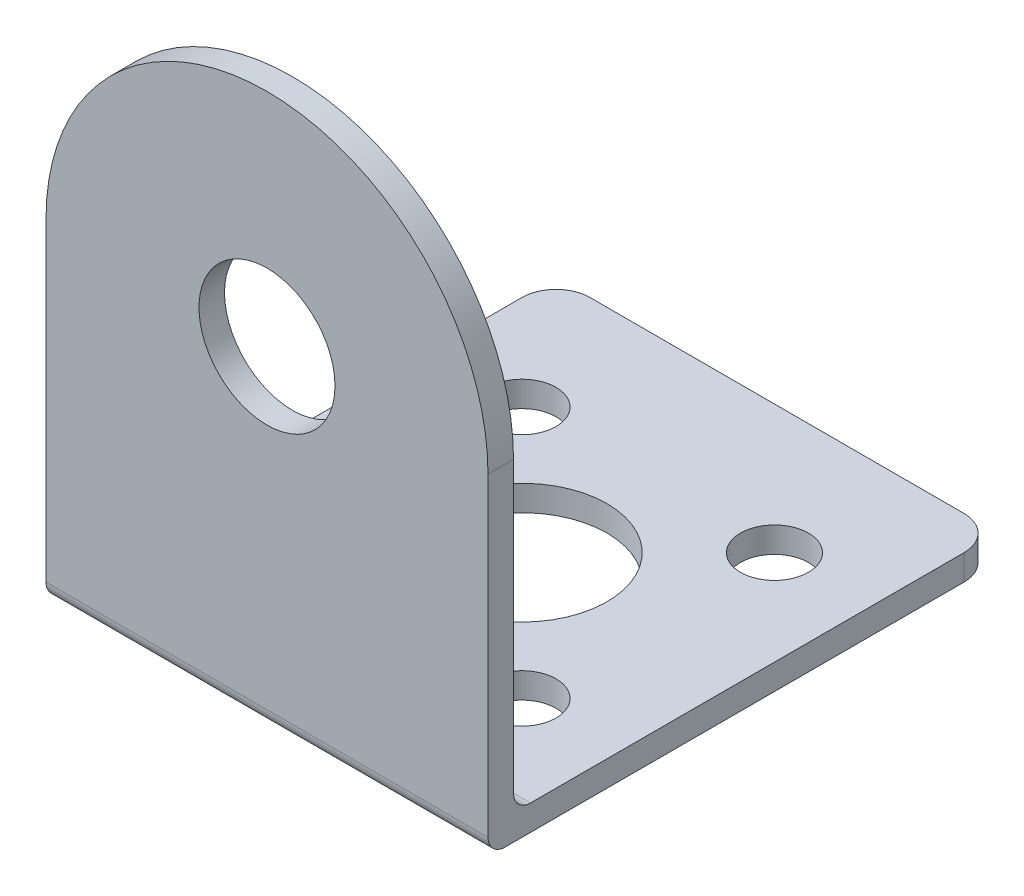
ISO-10303-21;
HEADER;
FILE_DESCRIPTION(('STEP AP214'),'2;1');
FILE_NAME('part.step','',(''),(''),'','','');
FILE_SCHEMA(('AUTOMOTIVE_DESIGN { 1 0 10303 214 1 1 1 1 }'));
ENDSEC;
DATA;
#1=APPLICATION_CONTEXT('core data for automotive mechanical design processes');
#2=APPLICATION_PROTOCOL_DEFINITION('international standard','automotive_design',2000,#1);
#3=PRODUCT_CONTEXT('',#1,'mechanical');
#4=PRODUCT('Part','Part','',(#3));
#5=PRODUCT_RELATED_PRODUCT_CATEGORY('part','',(#4));
#6=PRODUCT_DEFINITION_FORMATION('','',#4);
#7=PRODUCT_DEFINITION_CONTEXT('part definition',#1,'design');
#8=PRODUCT_DEFINITION('design','',#6,#7);
#9=PRODUCT_DEFINITION_SHAPE('','',#8);
#10=(LENGTH_UNIT() NAMED_UNIT(*) SI_UNIT(.MILLI.,.METRE.));
#11=(NAMED_UNIT(*) PLANE_ANGLE_UNIT() SI_UNIT($,.RADIAN.));
#12=(NAMED_UNIT(*) SI_UNIT($,.STERADIAN.) SOLID_ANGLE_UNIT());
#13=UNCERTAINTY_MEASURE_WITH_UNIT(LENGTH_MEASURE(1.E-05),#10,'distance_accuracy_value','');
#14=(GEOMETRIC_REPRESENTATION_CONTEXT(3) GLOBAL_UNCERTAINTY_ASSIGNED_CONTEXT((#13)) GLOBAL_UNIT_ASSIGNED_CONTEXT((#10,
#11,#12)) REPRESENTATION_CONTEXT('',''));
#15=CARTESIAN_POINT('',(0.,0.,0.));
#16=DIRECTION('',(0.,0.,1.));
#17=DIRECTION('',(1.,0.,0.));
#18=AXIS2_PLACEMENT_3D('',#15,#16,#17);
#19=CARTESIAN_POINT('',(13.,1.5,15.));
#20=DIRECTION('',(-1.,0.,0.));
#21=DIRECTION('',(0.,0.,1.));
#22=AXIS2_PLACEMENT_3D('',#19,#20,#21);
#23=PLANE('',#22);
#24=DIRECTION('',(0.,0.,-1.));
#25=VECTOR('',#24,1.);
#26=CARTESIAN_POINT('',(13.,0.,15.));
#27=LINE('',#26,#25);
#28=CARTESIAN_POINT('',(13.,0.,14.));
#29=VERTEX_POINT('',#28);
#30=CARTESIAN_POINT('',(13.,0.,-13.));
#31=VERTEX_POINT('',#30);
#32=EDGE_CURVE('E153',#29,#31,#27,.T.);
#33=ORIENTED_EDGE('',*,*,#32,.T.);
#34=DIRECTION('',(0.,-1.,0.));
#35=VECTOR('',#34,1.);
#36=CARTESIAN_POINT('',(13.,1.5,-13.));
#37=LINE('',#36,#35);
#38=CARTESIAN_POINT('',(13.,1.5,-13.));
#39=VERTEX_POINT('',#38);
#40=EDGE_CURVE('E11',#31,#39,#37,.F.);
#41=ORIENTED_EDGE('',*,*,#40,.T.);
#42=DIRECTION('',(0.,0.,-1.));
#43=VECTOR('',#42,1.);
#44=CARTESIAN_POINT('',(13.,1.5,15.));
#45=LINE('',#44,#43);
#46=CARTESIAN_POINT('',(13.,1.5,12.5));
#47=VERTEX_POINT('',#46);
#48=EDGE_CURVE('E155',#47,#39,#45,.T.);
#49=ORIENTED_EDGE('',*,*,#48,.F.);
#50=CARTESIAN_POINT('',(13.,2.5,12.5));
#51=DIRECTION('',(-1.,0.,0.));
#52=DIRECTION('',(0.,0.,1.));
#53=AXIS2_PLACEMENT_3D('',#50,#51,#52);
#54=CIRCLE('',#53,1.);
#55=CARTESIAN_POINT('',(13.,2.5,13.5));
#56=VERTEX_POINT('',#55);
#57=EDGE_CURVE('E123',#47,#56,#54,.T.);
#58=ORIENTED_EDGE('',*,*,#57,.T.);
#59=DIRECTION('',(0.,1.,0.));
#60=VECTOR('',#59,1.);
#61=CARTESIAN_POINT('',(13.,19.5,13.5));
#62=LINE('',#61,#60);
#63=CARTESIAN_POINT('',(13.,19.5,13.5));
#64=VERTEX_POINT('',#63);
#65=EDGE_CURVE('E118',#56,#64,#62,.T.);
#66=ORIENTED_EDGE('',*,*,#65,.T.);
#67=DIRECTION('',(0.,0.,1.));
#68=VECTOR('',#67,1.);
#69=CARTESIAN_POINT('',(13.,19.5,13.5));
#70=LINE('',#69,#68);
#71=CARTESIAN_POINT('',(13.,19.5,15.));
#72=VERTEX_POINT('',#71);
#73=EDGE_CURVE('E121',#64,#72,#70,.T.);
#74=ORIENTED_EDGE('',*,*,#73,.T.);
#75=DIRECTION('',(0.,-1.,0.));
#76=VECTOR('',#75,1.);
#77=CARTESIAN_POINT('',(13.,1.5,15.));
#78=LINE('',#77,#76);
#79=CARTESIAN_POINT('',(13.,1.,15.));
#80=VERTEX_POINT('',#79);
#81=EDGE_CURVE('E165',#72,#80,#78,.T.);
#82=ORIENTED_EDGE('',*,*,#81,.T.);
#83=CARTESIAN_POINT('',(13.,1.,14.));
#84=DIRECTION('',(-1.,0.,0.));
#85=DIRECTION('',(0.,0.,1.));
#86=AXIS2_PLACEMENT_3D('',#83,#84,#85);
#87=CIRCLE('',#86,1.);
#88=EDGE_CURVE('E187',#80,#29,#87,.F.);
#89=ORIENTED_EDGE('',*,*,#88,.T.);
#90=EDGE_LOOP('',(#33,#41,#49,#58,#66,#74,#82,#89));
#91=FACE_BOUND('',#90,.T.);
#92=ADVANCED_FACE('F39',(#91),#23,.F.);
#93=CARTESIAN_POINT('',(-13.,1.5,-15.));
#94=DIRECTION('',(0.,0.,1.));
#95=DIRECTION('',(1.,0.,0.));
#96=AXIS2_PLACEMENT_3D('',#93,#94,#95);
#97=PLANE('',#96);
#98=DIRECTION('',(-1.,0.,0.));
#99=VECTOR('',#98,1.);
#100=CARTESIAN_POINT('',(-13.,0.,-15.));
#101=LINE('',#100,#99);
#102=CARTESIAN_POINT('',(11.,0.,-15.));
#103=VERTEX_POINT('',#102);
#104=CARTESIAN_POINT('',(-11.,0.,-15.));
#105=VERTEX_POINT('',#104);
#106=EDGE_CURVE('E168',#103,#105,#101,.T.);
#107=ORIENTED_EDGE('',*,*,#106,.T.);
#108=DIRECTION('',(0.,-1.,0.));
#109=VECTOR('',#108,1.);
#110=CARTESIAN_POINT('',(-11.,1.5,-15.));
#111=LINE('',#110,#109);
#112=CARTESIAN_POINT('',(-11.,1.5,-15.));
#113=VERTEX_POINT('',#112);
#114=EDGE_CURVE('E61',#105,#113,#111,.F.);
#115=ORIENTED_EDGE('',*,*,#114,.T.);
#116=DIRECTION('',(-1.,0.,0.));
#117=VECTOR('',#116,1.);
#118=CARTESIAN_POINT('',(-13.,1.5,-15.));
#119=LINE('',#118,#117);
#120=CARTESIAN_POINT('',(11.,1.5,-15.));
#121=VERTEX_POINT('',#120);
#122=EDGE_CURVE('E158',#121,#113,#119,.T.);
#123=ORIENTED_EDGE('',*,*,#122,.F.);
#124=DIRECTION('',(0.,-1.,0.));
#125=VECTOR('',#124,1.);
#126=CARTESIAN_POINT('',(11.,1.5,-15.));
#127=LINE('',#126,#125);
#128=EDGE_CURVE('E220',#121,#103,#127,.T.);
#129=ORIENTED_EDGE('',*,*,#128,.T.);
#130=EDGE_LOOP('',(#107,#115,#123,#129));
#131=FACE_BOUND('',#130,.T.);
#132=ADVANCED_FACE('F244',(#131),#97,.F.);
#133=CARTESIAN_POINT('',(-13.,1.5,15.));
#134=DIRECTION('',(1.,0.,0.));
#135=DIRECTION('',(0.,0.,-1.));
#136=AXIS2_PLACEMENT_3D('',#133,#134,#135);
#137=PLANE('',#136);
#138=DIRECTION('',(0.,0.,1.));
#139=VECTOR('',#138,1.);
#140=CARTESIAN_POINT('',(-13.,1.5,15.));
#141=LINE('',#140,#139);
#142=CARTESIAN_POINT('',(-13.,1.5,-13.));
#143=VERTEX_POINT('',#142);
#144=CARTESIAN_POINT('',(-13.,1.5,12.5));
#145=VERTEX_POINT('',#144);
#146=EDGE_CURVE('E162',#143,#145,#141,.T.);
#147=ORIENTED_EDGE('',*,*,#146,.F.);
#148=DIRECTION('',(0.,-1.,0.));
#149=VECTOR('',#148,1.);
#150=CARTESIAN_POINT('',(-13.,1.5,-13.));
#151=LINE('',#150,#149);
#152=CARTESIAN_POINT('',(-13.,0.,-13.));
#153=VERTEX_POINT('',#152);
#154=EDGE_CURVE('E210',#143,#153,#151,.T.);
#155=ORIENTED_EDGE('',*,*,#154,.T.);
#156=DIRECTION('',(0.,0.,1.));
#157=VECTOR('',#156,1.);
#158=CARTESIAN_POINT('',(-13.,0.,15.));
#159=LINE('',#158,#157);
#160=CARTESIAN_POINT('',(-13.,0.,14.));
#161=VERTEX_POINT('',#160);
#162=EDGE_CURVE('E159',#153,#161,#159,.T.);
#163=ORIENTED_EDGE('',*,*,#162,.T.);
#164=CARTESIAN_POINT('',(-13.,1.,14.));
#165=DIRECTION('',(1.,0.,0.));
#166=DIRECTION('',(0.,0.,-1.));
#167=AXIS2_PLACEMENT_3D('',#164,#165,#166);
#168=CIRCLE('',#167,1.);
#169=CARTESIAN_POINT('',(-13.,1.,15.));
#170=VERTEX_POINT('',#169);
#171=EDGE_CURVE('E194',#161,#170,#168,.F.);
#172=ORIENTED_EDGE('',*,*,#171,.T.);
#173=DIRECTION('',(0.,-1.,0.));
#174=VECTOR('',#173,1.);
#175=CARTESIAN_POINT('',(-13.,1.5,15.));
#176=LINE('',#175,#174);
#177=CARTESIAN_POINT('',(-13.,19.5,15.));
#178=VERTEX_POINT('',#177);
#179=EDGE_CURVE('E175',#178,#170,#176,.T.);
#180=ORIENTED_EDGE('',*,*,#179,.F.);
#181=DIRECTION('',(0.,0.,1.));
#182=VECTOR('',#181,1.);
#183=CARTESIAN_POINT('',(-13.,19.5,13.5));
#184=LINE('',#183,#182);
#185=CARTESIAN_POINT('',(-13.,19.5,13.5));
#186=VERTEX_POINT('',#185);
#187=EDGE_CURVE('E138',#186,#178,#184,.T.);
#188=ORIENTED_EDGE('',*,*,#187,.F.);
#189=DIRECTION('',(0.,-1.,0.));
#190=VECTOR('',#189,1.);
#191=CARTESIAN_POINT('',(-13.,1.5,13.5));
#192=LINE('',#191,#190);
#193=CARTESIAN_POINT('',(-13.,2.5,13.5));
#194=VERTEX_POINT('',#193);
#195=EDGE_CURVE('E139',#186,#194,#192,.T.);
#196=ORIENTED_EDGE('',*,*,#195,.T.);
#197=CARTESIAN_POINT('',(-13.,2.5,12.5));
#198=DIRECTION('',(1.,0.,0.));
#199=DIRECTION('',(0.,0.,-1.));
#200=AXIS2_PLACEMENT_3D('',#197,#198,#199);
#201=CIRCLE('',#200,1.);
#202=EDGE_CURVE('E206',#194,#145,#201,.T.);
#203=ORIENTED_EDGE('',*,*,#202,.T.);
#204=EDGE_LOOP('',(#147,#155,#163,#172,#180,#188,#196,#203));
#205=FACE_BOUND('',#204,.T.);
#206=ADVANCED_FACE('F236',(#205),#137,.F.);
#207=CARTESIAN_POINT('',(-13.,1.5,15.));
#208=DIRECTION('',(0.,0.,-1.));
#209=DIRECTION('',(-1.,0.,0.));
#210=AXIS2_PLACEMENT_3D('',#207,#208,#209);
#211=PLANE('',#210);
#212=CARTESIAN_POINT('',(0.,19.5,15.));
#213=DIRECTION('',(0.,0.,1.));
#214=DIRECTION('',(1.,0.,0.));
#215=AXIS2_PLACEMENT_3D('',#212,#213,#214);
#216=CIRCLE('',#215,4.);
#217=CARTESIAN_POINT('',(4.,19.5,15.));
#218=VERTEX_POINT('',#217);
#219=EDGE_CURVE('E183',#218,#218,#216,.T.);
#220=ORIENTED_EDGE('',*,*,#219,.F.);
#221=EDGE_LOOP('',(#220));
#222=FACE_BOUND('',#221,.T.);
#223=ORIENTED_EDGE('',*,*,#179,.T.);
#224=DIRECTION('',(1.,0.,0.));
#225=VECTOR('',#224,1.);
#226=CARTESIAN_POINT('',(13.,1.,15.));
#227=LINE('',#226,#225);
#228=EDGE_CURVE('E179',#170,#80,#227,.T.);
#229=ORIENTED_EDGE('',*,*,#228,.T.);
#230=ORIENTED_EDGE('',*,*,#81,.F.);
#231=CARTESIAN_POINT('',(0.,19.5,15.));
#232=DIRECTION('',(0.,0.,1.));
#233=DIRECTION('',(-1.,0.,0.));
#234=AXIS2_PLACEMENT_3D('',#231,#232,#233);
#235=CIRCLE('',#234,13.);
#236=EDGE_CURVE('E129',#72,#178,#235,.T.);
#237=ORIENTED_EDGE('',*,*,#236,.T.);
#238=EDGE_LOOP('',(#223,#229,#230,#237));
#239=FACE_BOUND('',#238,.T.);
#240=ADVANCED_FACE('F255',(#222,#239),#211,.F.);
#241=CARTESIAN_POINT('',(0.,1.5,0.));
#242=DIRECTION('',(0.,-1.,0.));
#243=DIRECTION('',(0.,0.,-1.));
#244=AXIS2_PLACEMENT_3D('',#241,#242,#243);
#245=PLANE('',#244);
#246=CARTESIAN_POINT('',(7.42462120245871,1.5,7.42462120245879));
#247=DIRECTION('',(0.,-1.,0.));
#248=DIRECTION('',(0.,0.,-1.));
#249=AXIS2_PLACEMENT_3D('',#246,#247,#248);
#250=CIRCLE('',#249,1.99999999999996);
#251=CARTESIAN_POINT('',(7.42462120245871,1.5,5.42462120245883));
#252=VERTEX_POINT('',#251);
#253=EDGE_CURVE('E328',#252,#252,#250,.T.);
#254=ORIENTED_EDGE('',*,*,#253,.T.);
#255=EDGE_LOOP('',(#254));
#256=FACE_BOUND('',#255,.T.);
#257=CARTESIAN_POINT('',(-7.42462120245866,1.5,-7.42462120245884));
#258=DIRECTION('',(0.,-1.,0.));
#259=DIRECTION('',(0.,0.,-1.));
#260=AXIS2_PLACEMENT_3D('',#257,#258,#259);
#261=CIRCLE('',#260,1.99999999999996);
#262=CARTESIAN_POINT('',(-7.42462120245866,1.5,-9.4246212024588));
#263=VERTEX_POINT('',#262);
#264=EDGE_CURVE('E322',#263,#263,#261,.T.);
#265=ORIENTED_EDGE('',*,*,#264,.T.);
#266=EDGE_LOOP('',(#265));
#267=FACE_BOUND('',#266,.T.);
#268=CARTESIAN_POINT('',(-7.42462120245882,1.5,7.42462120245869));
#269=DIRECTION('',(0.,-1.,0.));
#270=DIRECTION('',(0.,0.,-1.));
#271=AXIS2_PLACEMENT_3D('',#268,#269,#270);
#272=CIRCLE('',#271,2.);
#273=CARTESIAN_POINT('',(-7.42462120245882,1.5,5.42462120245868));
#274=VERTEX_POINT('',#273);
#275=EDGE_CURVE('E319',#274,#274,#272,.T.);
#276=ORIENTED_EDGE('',*,*,#275,.T.);
#277=EDGE_LOOP('',(#276));
#278=FACE_BOUND('',#277,.T.);
#279=CARTESIAN_POINT('',(7.42462120245877,1.5,-7.42462120245873));
#280=DIRECTION('',(0.,-1.,0.));
#281=DIRECTION('',(0.,0.,-1.));
#282=AXIS2_PLACEMENT_3D('',#279,#280,#281);
#283=CIRCLE('',#282,2.);
#284=CARTESIAN_POINT('',(7.42462120245877,1.5,-9.42462120245873));
#285=VERTEX_POINT('',#284);
#286=EDGE_CURVE('E323',#285,#285,#283,.T.);
#287=ORIENTED_EDGE('',*,*,#286,.T.);
#288=EDGE_LOOP('',(#287));
#289=FACE_BOUND('',#288,.T.);
#290=CARTESIAN_POINT('',(0.,1.5,0.));
#291=DIRECTION('',(0.,-1.,0.));
#292=DIRECTION('',(0.,0.,-1.));
#293=AXIS2_PLACEMENT_3D('',#290,#291,#292);
#294=CIRCLE('',#293,5.);
#295=CARTESIAN_POINT('',(0.,1.5,-5.));
#296=VERTEX_POINT('',#295);
#297=EDGE_CURVE('E331',#296,#296,#294,.T.);
#298=ORIENTED_EDGE('',*,*,#297,.T.);
#299=EDGE_LOOP('',(#298));
#300=FACE_BOUND('',#299,.T.);
#301=ORIENTED_EDGE('',*,*,#122,.T.);
#302=CARTESIAN_POINT('',(-11.,1.5,-13.));
#303=DIRECTION('',(0.,-1.,0.));
#304=DIRECTION('',(0.,0.,-1.));
#305=AXIS2_PLACEMENT_3D('',#302,#303,#304);
#306=CIRCLE('',#305,2.);
#307=EDGE_CURVE('E48',#113,#143,#306,.F.);
#308=ORIENTED_EDGE('',*,*,#307,.T.);
#309=ORIENTED_EDGE('',*,*,#146,.T.);
#310=DIRECTION('',(1.,0.,0.));
#311=VECTOR('',#310,1.);
#312=CARTESIAN_POINT('',(0.,1.5,12.5));
#313=LINE('',#312,#311);
#314=EDGE_CURVE('E197',#145,#47,#313,.T.);
#315=ORIENTED_EDGE('',*,*,#314,.T.);
#316=ORIENTED_EDGE('',*,*,#48,.T.);
#317=CARTESIAN_POINT('',(11.,1.5,-13.));
#318=DIRECTION('',(0.,-1.,0.));
#319=DIRECTION('',(0.,0.,-1.));
#320=AXIS2_PLACEMENT_3D('',#317,#318,#319);
#321=CIRCLE('',#320,2.);
#322=EDGE_CURVE('E226',#39,#121,#321,.F.);
#323=ORIENTED_EDGE('',*,*,#322,.T.);
#324=EDGE_LOOP('',(#301,#308,#309,#315,#316,#323));
#325=FACE_BOUND('',#324,.T.);
#326=ADVANCED_FACE('F232',(#256,#267,#278,#289,#300,#325),#245,.F.);
#327=CARTESIAN_POINT('',(0.,0.,0.));
#328=DIRECTION('',(0.,-1.,0.));
#329=DIRECTION('',(0.,0.,-1.));
#330=AXIS2_PLACEMENT_3D('',#327,#328,#329);
#331=PLANE('',#330);
#332=CARTESIAN_POINT('',(7.42462120245871,0.,7.42462120245879));
#333=DIRECTION('',(0.,-1.,0.));
#334=DIRECTION('',(0.,0.,-1.));
#335=AXIS2_PLACEMENT_3D('',#332,#333,#334);
#336=CIRCLE('',#335,1.99999999999996);
#337=CARTESIAN_POINT('',(7.42462120245871,0.,5.42462120245883));
#338=VERTEX_POINT('',#337);
#339=EDGE_CURVE('E355',#338,#338,#336,.T.);
#340=ORIENTED_EDGE('',*,*,#339,.F.);
#341=EDGE_LOOP('',(#340));
#342=FACE_BOUND('',#341,.T.);
#343=CARTESIAN_POINT('',(-7.42462120245866,0.,-7.42462120245884));
#344=DIRECTION('',(0.,-1.,0.));
#345=DIRECTION('',(0.,0.,-1.));
#346=AXIS2_PLACEMENT_3D('',#343,#344,#345);
#347=CIRCLE('',#346,1.99999999999996);
#348=CARTESIAN_POINT('',(-7.42462120245866,0.,-9.4246212024588));
#349=VERTEX_POINT('',#348);
#350=EDGE_CURVE('E358',#349,#349,#347,.T.);
#351=ORIENTED_EDGE('',*,*,#350,.F.);
#352=EDGE_LOOP('',(#351));
#353=FACE_BOUND('',#352,.T.);
#354=CARTESIAN_POINT('',(-7.42462120245882,0.,7.42462120245869));
#355=DIRECTION('',(0.,-1.,0.));
#356=DIRECTION('',(0.,0.,-1.));
#357=AXIS2_PLACEMENT_3D('',#354,#355,#356);
#358=CIRCLE('',#357,2.);
#359=CARTESIAN_POINT('',(-7.42462120245882,0.,5.42462120245868));
#360=VERTEX_POINT('',#359);
#361=EDGE_CURVE('E316',#360,#360,#358,.T.);
#362=ORIENTED_EDGE('',*,*,#361,.F.);
#363=EDGE_LOOP('',(#362));
#364=FACE_BOUND('',#363,.T.);
#365=CARTESIAN_POINT('',(7.42462120245877,0.,-7.42462120245873));
#366=DIRECTION('',(0.,-1.,0.));
#367=DIRECTION('',(0.,0.,-1.));
#368=AXIS2_PLACEMENT_3D('',#365,#366,#367);
#369=CIRCLE('',#368,2.);
#370=CARTESIAN_POINT('',(7.42462120245877,0.,-9.42462120245873));
#371=VERTEX_POINT('',#370);
#372=EDGE_CURVE('E365',#371,#371,#369,.T.);
#373=ORIENTED_EDGE('',*,*,#372,.F.);
#374=EDGE_LOOP('',(#373));
#375=FACE_BOUND('',#374,.T.);
#376=CARTESIAN_POINT('',(0.,0.,0.));
#377=DIRECTION('',(0.,-1.,0.));
#378=DIRECTION('',(0.,0.,-1.));
#379=AXIS2_PLACEMENT_3D('',#376,#377,#378);
#380=CIRCLE('',#379,5.);
#381=CARTESIAN_POINT('',(0.,0.,-5.));
#382=VERTEX_POINT('',#381);
#383=EDGE_CURVE('E352',#382,#382,#380,.T.);
#384=ORIENTED_EDGE('',*,*,#383,.F.);
#385=EDGE_LOOP('',(#384));
#386=FACE_BOUND('',#385,.T.);
#387=ORIENTED_EDGE('',*,*,#162,.F.);
#388=CARTESIAN_POINT('',(-11.,0.,-13.));
#389=DIRECTION('',(0.,-1.,0.));
#390=DIRECTION('',(0.,0.,-1.));
#391=AXIS2_PLACEMENT_3D('',#388,#389,#390);
#392=CIRCLE('',#391,2.);
#393=EDGE_CURVE('E217',#153,#105,#392,.T.);
#394=ORIENTED_EDGE('',*,*,#393,.T.);
#395=ORIENTED_EDGE('',*,*,#106,.F.);
#396=CARTESIAN_POINT('',(11.,0.,-13.));
#397=DIRECTION('',(0.,-1.,0.));
#398=DIRECTION('',(0.,0.,-1.));
#399=AXIS2_PLACEMENT_3D('',#396,#397,#398);
#400=CIRCLE('',#399,2.);
#401=EDGE_CURVE('E214',#103,#31,#400,.T.);
#402=ORIENTED_EDGE('',*,*,#401,.T.);
#403=ORIENTED_EDGE('',*,*,#32,.F.);
#404=DIRECTION('',(1.,0.,0.));
#405=VECTOR('',#404,1.);
#406=CARTESIAN_POINT('',(-13.,0.,14.));
#407=LINE('',#406,#405);
#408=EDGE_CURVE('E190',#29,#161,#407,.F.);
#409=ORIENTED_EDGE('',*,*,#408,.T.);
#410=EDGE_LOOP('',(#387,#394,#395,#402,#403,#409));
#411=FACE_BOUND('',#410,.T.);
#412=ADVANCED_FACE('F243',(#342,#353,#364,#375,#386,#411),#331,.T.);
#413=CARTESIAN_POINT('',(0.,19.5,13.5));
#414=DIRECTION('',(0.,0.,1.));
#415=DIRECTION('',(1.,0.,0.));
#416=AXIS2_PLACEMENT_3D('',#413,#414,#415);
#417=CYLINDRICAL_SURFACE('',#416,13.);
#418=ORIENTED_EDGE('',*,*,#236,.F.);
#419=ORIENTED_EDGE('',*,*,#73,.F.);
#420=CARTESIAN_POINT('',(0.,19.5,13.5));
#421=DIRECTION('',(0.,0.,1.));
#422=DIRECTION('',(-1.,0.,0.));
#423=AXIS2_PLACEMENT_3D('',#420,#421,#422);
#424=CIRCLE('',#423,13.);
#425=EDGE_CURVE('E128',#64,#186,#424,.T.);
#426=ORIENTED_EDGE('',*,*,#425,.T.);
#427=ORIENTED_EDGE('',*,*,#187,.T.);
#428=EDGE_LOOP('',(#418,#419,#426,#427));
#429=FACE_BOUND('',#428,.T.);
#430=ADVANCED_FACE('F133',(#429),#417,.T.);
#431=CARTESIAN_POINT('',(0.,19.5,13.5));
#432=DIRECTION('',(0.,0.,-1.));
#433=DIRECTION('',(-1.,0.,0.));
#434=AXIS2_PLACEMENT_3D('',#431,#432,#433);
#435=PLANE('',#434);
#436=CARTESIAN_POINT('',(0.,19.5,13.5));
#437=DIRECTION('',(0.,0.,-1.));
#438=DIRECTION('',(-1.,0.,0.));
#439=AXIS2_PLACEMENT_3D('',#436,#437,#438);
#440=CIRCLE('',#439,4.);
#441=CARTESIAN_POINT('',(-4.,19.5,13.5));
#442=VERTEX_POINT('',#441);
#443=EDGE_CURVE('E151',#442,#442,#440,.T.);
#444=ORIENTED_EDGE('',*,*,#443,.F.);
#445=EDGE_LOOP('',(#444));
#446=FACE_BOUND('',#445,.T.);
#447=ORIENTED_EDGE('',*,*,#65,.F.);
#448=DIRECTION('',(1.,0.,0.));
#449=VECTOR('',#448,1.);
#450=CARTESIAN_POINT('',(0.,2.5,13.5));
#451=LINE('',#450,#449);
#452=EDGE_CURVE('E201',#56,#194,#451,.F.);
#453=ORIENTED_EDGE('',*,*,#452,.T.);
#454=ORIENTED_EDGE('',*,*,#195,.F.);
#455=ORIENTED_EDGE('',*,*,#425,.F.);
#456=EDGE_LOOP('',(#447,#453,#454,#455));
#457=FACE_BOUND('',#456,.T.);
#458=ADVANCED_FACE('F141',(#446,#457),#435,.T.);
#459=CARTESIAN_POINT('',(0.,19.5,-15.));
#460=DIRECTION('',(0.,0.,1.));
#461=DIRECTION('',(1.,0.,0.));
#462=AXIS2_PLACEMENT_3D('',#459,#460,#461);
#463=CYLINDRICAL_SURFACE('',#462,4.);
#464=ORIENTED_EDGE('',*,*,#443,.T.);
#465=EDGE_LOOP('',(#464));
#466=FACE_BOUND('',#465,.T.);
#467=ORIENTED_EDGE('',*,*,#219,.T.);
#468=EDGE_LOOP('',(#467));
#469=FACE_BOUND('',#468,.T.);
#470=ADVANCED_FACE('F264',(#466,#469),#463,.F.);
#471=CARTESIAN_POINT('',(-13.,1.,14.));
#472=DIRECTION('',(-1.,0.,0.));
#473=DIRECTION('',(0.,0.,1.));
#474=AXIS2_PLACEMENT_3D('',#471,#472,#473);
#475=CYLINDRICAL_SURFACE('',#474,1.);
#476=ORIENTED_EDGE('',*,*,#171,.F.);
#477=ORIENTED_EDGE('',*,*,#408,.F.);
#478=ORIENTED_EDGE('',*,*,#88,.F.);
#479=ORIENTED_EDGE('',*,*,#228,.F.);
#480=EDGE_LOOP('',(#476,#477,#478,#479));
#481=FACE_BOUND('',#480,.T.);
#482=ADVANCED_FACE('F253',(#481),#475,.T.);
#483=CARTESIAN_POINT('',(0.,2.5,12.5));
#484=DIRECTION('',(1.,0.,0.));
#485=DIRECTION('',(0.,0.,-1.));
#486=AXIS2_PLACEMENT_3D('',#483,#484,#485);
#487=CYLINDRICAL_SURFACE('',#486,1.);
#488=ORIENTED_EDGE('',*,*,#202,.F.);
#489=ORIENTED_EDGE('',*,*,#452,.F.);
#490=ORIENTED_EDGE('',*,*,#57,.F.);
#491=ORIENTED_EDGE('',*,*,#314,.F.);
#492=EDGE_LOOP('',(#488,#489,#490,#491));
#493=FACE_BOUND('',#492,.T.);
#494=ADVANCED_FACE('F257',(#493),#487,.F.);
#495=CARTESIAN_POINT('',(-11.,1.5,-13.));
#496=DIRECTION('',(0.,-1.,0.));
#497=DIRECTION('',(0.,0.,-1.));
#498=AXIS2_PLACEMENT_3D('',#495,#496,#497);
#499=CYLINDRICAL_SURFACE('',#498,2.);
#500=ORIENTED_EDGE('',*,*,#307,.F.);
#501=ORIENTED_EDGE('',*,*,#114,.F.);
#502=ORIENTED_EDGE('',*,*,#393,.F.);
#503=ORIENTED_EDGE('',*,*,#154,.F.);
#504=EDGE_LOOP('',(#500,#501,#502,#503));
#505=FACE_BOUND('',#504,.T.);
#506=ADVANCED_FACE('F240',(#505),#499,.T.);
#507=CARTESIAN_POINT('',(11.,1.5,-13.));
#508=DIRECTION('',(0.,-1.,0.));
#509=DIRECTION('',(0.,0.,-1.));
#510=AXIS2_PLACEMENT_3D('',#507,#508,#509);
#511=CYLINDRICAL_SURFACE('',#510,2.);
#512=ORIENTED_EDGE('',*,*,#322,.F.);
#513=ORIENTED_EDGE('',*,*,#40,.F.);
#514=ORIENTED_EDGE('',*,*,#401,.F.);
#515=ORIENTED_EDGE('',*,*,#128,.F.);
#516=EDGE_LOOP('',(#512,#513,#514,#515));
#517=FACE_BOUND('',#516,.T.);
#518=ADVANCED_FACE('F41',(#517),#511,.T.);
#519=CARTESIAN_POINT('',(0.,32.5,0.));
#520=DIRECTION('',(0.,-1.,0.));
#521=DIRECTION('',(0.,0.,-1.));
#522=AXIS2_PLACEMENT_3D('',#519,#520,#521);
#523=CYLINDRICAL_SURFACE('',#522,5.);
#524=ORIENTED_EDGE('',*,*,#383,.T.);
#525=EDGE_LOOP('',(#524));
#526=FACE_BOUND('',#525,.T.);
#527=ORIENTED_EDGE('',*,*,#297,.F.);
#528=EDGE_LOOP('',(#527));
#529=FACE_BOUND('',#528,.T.);
#530=ADVANCED_FACE('F292',(#526,#529),#523,.F.);
#531=CARTESIAN_POINT('',(7.42462120245877,32.5,-7.42462120245873));
#532=DIRECTION('',(0.,-1.,0.));
#533=DIRECTION('',(0.,0.,-1.));
#534=AXIS2_PLACEMENT_3D('',#531,#532,#533);
#535=CYLINDRICAL_SURFACE('',#534,2.);
#536=ORIENTED_EDGE('',*,*,#372,.T.);
#537=EDGE_LOOP('',(#536));
#538=FACE_BOUND('',#537,.T.);
#539=ORIENTED_EDGE('',*,*,#286,.F.);
#540=EDGE_LOOP('',(#539));
#541=FACE_BOUND('',#540,.T.);
#542=ADVANCED_FACE('F295',(#538,#541),#535,.F.);
#543=CARTESIAN_POINT('',(-7.42462120245882,32.5,7.42462120245869));
#544=DIRECTION('',(0.,-1.,0.));
#545=DIRECTION('',(0.,0.,-1.));
#546=AXIS2_PLACEMENT_3D('',#543,#544,#545);
#547=CYLINDRICAL_SURFACE('',#546,2.);
#548=ORIENTED_EDGE('',*,*,#361,.T.);
#549=EDGE_LOOP('',(#548));
#550=FACE_BOUND('',#549,.T.);
#551=ORIENTED_EDGE('',*,*,#275,.F.);
#552=EDGE_LOOP('',(#551));
#553=FACE_BOUND('',#552,.T.);
#554=ADVANCED_FACE('F301',(#550,#553),#547,.F.);
#555=CARTESIAN_POINT('',(-7.42462120245866,32.5,-7.42462120245884));
#556=DIRECTION('',(0.,-1.,0.));
#557=DIRECTION('',(0.,0.,-1.));
#558=AXIS2_PLACEMENT_3D('',#555,#556,#557);
#559=CYLINDRICAL_SURFACE('',#558,1.99999999999996);
#560=ORIENTED_EDGE('',*,*,#350,.T.);
#561=EDGE_LOOP('',(#560));
#562=FACE_BOUND('',#561,.T.);
#563=ORIENTED_EDGE('',*,*,#264,.F.);
#564=EDGE_LOOP('',(#563));
#565=FACE_BOUND('',#564,.T.);
#566=ADVANCED_FACE('F297',(#562,#565),#559,.F.);
#567=CARTESIAN_POINT('',(7.42462120245871,32.5,7.42462120245879));
#568=DIRECTION('',(0.,-1.,0.));
#569=DIRECTION('',(0.,0.,-1.));
#570=AXIS2_PLACEMENT_3D('',#567,#568,#569);
#571=CYLINDRICAL_SURFACE('',#570,1.99999999999996);
#572=ORIENTED_EDGE('',*,*,#339,.T.);
#573=EDGE_LOOP('',(#572));
#574=FACE_BOUND('',#573,.T.);
#575=ORIENTED_EDGE('',*,*,#253,.F.);
#576=EDGE_LOOP('',(#575));
#577=FACE_BOUND('',#576,.T.);
#578=ADVANCED_FACE('F300',(#574,#577),#571,.F.);
#579=CLOSED_SHELL('',(#92,#132,#206,#240,#326,#412,#430,#458,#470,#482,#494,#506,#518,#530,#542,
#554,#566,#578));
#580=MANIFOLD_SOLID_BREP('B2',#579);
#581=ADVANCED_BREP_SHAPE_REPRESENTATION('',(#18,#580),#14);
#582=SHAPE_DEFINITION_REPRESENTATION(#9,#581);
ENDSEC;
END-ISO-10303-21;
